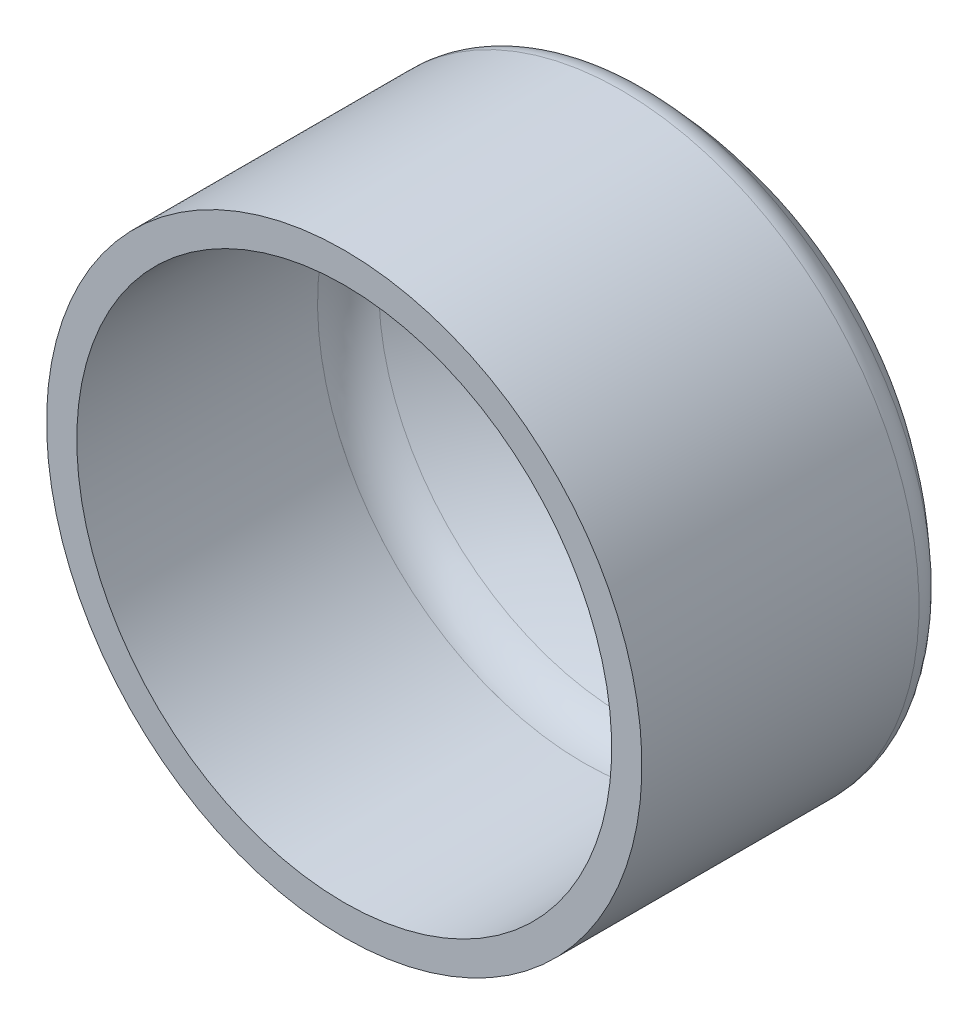
ISO-10303-21;
HEADER;
FILE_DESCRIPTION(('STEP AP214'),'2;1');
FILE_NAME('part.step','',(''),(''),'','','');
FILE_SCHEMA(('AUTOMOTIVE_DESIGN { 1 0 10303 214 1 1 1 1 }'));
ENDSEC;
DATA;
#1=APPLICATION_CONTEXT('core data for automotive mechanical design processes');
#2=APPLICATION_PROTOCOL_DEFINITION('international standard','automotive_design',2000,#1);
#3=PRODUCT_CONTEXT('',#1,'mechanical');
#4=PRODUCT('Part','Part','',(#3));
#5=PRODUCT_RELATED_PRODUCT_CATEGORY('part','',(#4));
#6=PRODUCT_DEFINITION_FORMATION('','',#4);
#7=PRODUCT_DEFINITION_CONTEXT('part definition',#1,'design');
#8=PRODUCT_DEFINITION('design','',#6,#7);
#9=PRODUCT_DEFINITION_SHAPE('','',#8);
#10=(LENGTH_UNIT() NAMED_UNIT(*) SI_UNIT(.MILLI.,.METRE.));
#11=(NAMED_UNIT(*) PLANE_ANGLE_UNIT() SI_UNIT($,.RADIAN.));
#12=(NAMED_UNIT(*) SI_UNIT($,.STERADIAN.) SOLID_ANGLE_UNIT());
#13=UNCERTAINTY_MEASURE_WITH_UNIT(LENGTH_MEASURE(1.E-05),#10,'distance_accuracy_value','');
#14=(GEOMETRIC_REPRESENTATION_CONTEXT(3) GLOBAL_UNCERTAINTY_ASSIGNED_CONTEXT((#13)) GLOBAL_UNIT_ASSIGNED_CONTEXT((#10,
#11,#12)) REPRESENTATION_CONTEXT('',''));
#15=CARTESIAN_POINT('',(0.,0.,0.));
#16=DIRECTION('',(0.,0.,1.));
#17=DIRECTION('',(1.,0.,0.));
#18=AXIS2_PLACEMENT_3D('',#15,#16,#17);
#19=CARTESIAN_POINT('',(0.,0.,45.339));
#20=DIRECTION('',(0.,0.,1.));
#21=DIRECTION('',(0.,-1.,0.));
#22=AXIS2_PLACEMENT_3D('',#19,#20,#21);
#23=SPHERICAL_SURFACE('',#22,80.9498);
#24=CARTESIAN_POINT('',(0.,0.,-15.9266692871763));
#25=DIRECTION('',(0.,0.,1.));
#26=DIRECTION('',(0.,-1.,0.));
#27=AXIS2_PLACEMENT_3D('',#24,#25,#26);
#28=CIRCLE('',#27,52.9092419793966);
#29=CARTESIAN_POINT('',(0.,-52.9092419793966,-15.9266692871763));
#30=VERTEX_POINT('',#29);
#31=EDGE_CURVE('E41',#30,#30,#28,.T.);
#32=ORIENTED_EDGE('',*,*,#31,.T.);
#33=EDGE_LOOP('',(#32));
#34=FACE_BOUND('',#33,.T.);
#35=ADVANCED_FACE('F30',(#34),#23,.F.);
#36=CARTESIAN_POINT('',(0.,0.,-6.91079263336841));
#37=DIRECTION('',(0.,0.,1.));
#38=DIRECTION('',(0.,-1.,0.));
#39=AXIS2_PLACEMENT_3D('',#36,#37,#38);
#40=TOROIDAL_SURFACE('',#39,45.1231,11.9126);
#41=CARTESIAN_POINT('',(0.,0.,-6.91079263336841));
#42=DIRECTION('',(0.,0.,1.));
#43=DIRECTION('',(0.,-1.,0.));
#44=AXIS2_PLACEMENT_3D('',#41,#42,#43);
#45=CIRCLE('',#44,57.0357);
#46=CARTESIAN_POINT('',(0.,-57.0357,-6.91079263336841));
#47=VERTEX_POINT('',#46);
#48=EDGE_CURVE('E45',#47,#47,#45,.T.);
#49=ORIENTED_EDGE('',*,*,#48,.T.);
#50=EDGE_LOOP('',(#49));
#51=FACE_BOUND('',#50,.T.);
#52=ORIENTED_EDGE('',*,*,#31,.F.);
#53=EDGE_LOOP('',(#52));
#54=FACE_BOUND('',#53,.T.);
#55=ADVANCED_FACE('F75',(#51,#54),#40,.F.);
#56=CARTESIAN_POINT('',(0.,0.,44.3992));
#57=DIRECTION('',(0.,0.,1.));
#58=DIRECTION('',(0.,-1.,0.));
#59=AXIS2_PLACEMENT_3D('',#56,#57,#58);
#60=CYLINDRICAL_SURFACE('',#59,57.0357);
#61=CARTESIAN_POINT('',(0.,0.,-6.90880000000001));
#62=DIRECTION('',(0.,0.,1.));
#63=DIRECTION('',(0.,-1.,0.));
#64=AXIS2_PLACEMENT_3D('',#61,#62,#63);
#65=CIRCLE('',#64,57.0357);
#66=CARTESIAN_POINT('',(0.,-57.0357,-6.90880000000001));
#67=VERTEX_POINT('',#66);
#68=EDGE_CURVE('E50',#67,#67,#65,.T.);
#69=ORIENTED_EDGE('',*,*,#68,.T.);
#70=EDGE_LOOP('',(#69));
#71=FACE_BOUND('',#70,.T.);
#72=ORIENTED_EDGE('',*,*,#48,.F.);
#73=EDGE_LOOP('',(#72));
#74=FACE_BOUND('',#73,.T.);
#75=ADVANCED_FACE('F80',(#71,#74),#60,.F.);
#76=CARTESIAN_POINT('',(0.,0.,-6.90880000000001));
#77=DIRECTION('',(0.,0.,1.));
#78=DIRECTION('',(0.,-1.,0.));
#79=AXIS2_PLACEMENT_3D('',#76,#77,#78);
#80=CONICAL_SURFACE('',#79,57.0357,0.0066830688188426);
#81=CARTESIAN_POINT('',(0.,0.,44.3992));
#82=DIRECTION('',(0.,0.,1.));
#83=DIRECTION('',(0.,-1.,0.));
#84=AXIS2_PLACEMENT_3D('',#81,#82,#83);
#85=CIRCLE('',#84,57.3786);
#86=CARTESIAN_POINT('',(0.,-57.3786,44.3992));
#87=VERTEX_POINT('',#86);
#88=EDGE_CURVE('E53',#87,#87,#85,.T.);
#89=ORIENTED_EDGE('',*,*,#88,.T.);
#90=EDGE_LOOP('',(#89));
#91=FACE_BOUND('',#90,.T.);
#92=ORIENTED_EDGE('',*,*,#68,.F.);
#93=EDGE_LOOP('',(#92));
#94=FACE_BOUND('',#93,.T.);
#95=ADVANCED_FACE('F72',(#91,#94),#80,.F.);
#96=CARTESIAN_POINT('',(0.,-57.3786,44.3992));
#97=DIRECTION('',(0.,0.,1.));
#98=DIRECTION('',(0.,-1.,0.));
#99=AXIS2_PLACEMENT_3D('',#96,#97,#98);
#100=PLANE('',#99);
#101=CARTESIAN_POINT('',(0.,0.,44.3992));
#102=DIRECTION('',(0.,0.,1.));
#103=DIRECTION('',(0.,-1.,0.));
#104=AXIS2_PLACEMENT_3D('',#101,#102,#103);
#105=CIRCLE('',#104,63.8556);
#106=CARTESIAN_POINT('',(0.,-63.8556,44.3992));
#107=VERTEX_POINT('',#106);
#108=EDGE_CURVE('E56',#107,#107,#105,.T.);
#109=ORIENTED_EDGE('',*,*,#108,.T.);
#110=EDGE_LOOP('',(#109));
#111=FACE_BOUND('',#110,.T.);
#112=ORIENTED_EDGE('',*,*,#88,.F.);
#113=EDGE_LOOP('',(#112));
#114=FACE_BOUND('',#113,.T.);
#115=ADVANCED_FACE('F60',(#111,#114),#100,.T.);
#116=CARTESIAN_POINT('',(0.,0.,44.3992));
#117=DIRECTION('',(0.,0.,1.));
#118=DIRECTION('',(0.,-1.,0.));
#119=AXIS2_PLACEMENT_3D('',#116,#117,#118);
#120=CYLINDRICAL_SURFACE('',#119,63.8556);
#121=CARTESIAN_POINT('',(0.,0.,-15.0488950442885));
#122=DIRECTION('',(0.,0.,1.));
#123=DIRECTION('',(0.,-1.,0.));
#124=AXIS2_PLACEMENT_3D('',#121,#122,#123);
#125=CIRCLE('',#124,63.8556);
#126=CARTESIAN_POINT('',(0.,-63.8556,-15.0488950442885));
#127=VERTEX_POINT('',#126);
#128=EDGE_CURVE('E37',#127,#127,#125,.T.);
#129=ORIENTED_EDGE('',*,*,#128,.T.);
#130=EDGE_LOOP('',(#129));
#131=FACE_BOUND('',#130,.T.);
#132=ORIENTED_EDGE('',*,*,#108,.F.);
#133=EDGE_LOOP('',(#132));
#134=FACE_BOUND('',#133,.T.);
#135=ADVANCED_FACE('F63',(#131,#134),#120,.T.);
#136=CARTESIAN_POINT('',(0.,0.,45.339));
#137=DIRECTION('',(0.,0.,1.));
#138=DIRECTION('',(0.,-1.,0.));
#139=AXIS2_PLACEMENT_3D('',#136,#137,#138);
#140=SPHERICAL_SURFACE('',#139,89.7382);
#141=CARTESIAN_POINT('',(0.,0.,-19.6474249745572));
#142=DIRECTION('',(0.,0.,1.));
#143=DIRECTION('',(0.,-1.,0.));
#144=AXIS2_PLACEMENT_3D('',#141,#142,#143);
#145=CIRCLE('',#144,61.8846435577216);
#146=CARTESIAN_POINT('',(0.,-61.8846435577216,-19.6474249745572));
#147=VERTEX_POINT('',#146);
#148=EDGE_CURVE('E10',#147,#147,#145,.F.);
#149=ORIENTED_EDGE('',*,*,#148,.T.);
#150=EDGE_LOOP('',(#149));
#151=FACE_BOUND('',#150,.T.);
#152=ADVANCED_FACE('F65',(#151),#140,.T.);
#153=CARTESIAN_POINT('',(0.,0.,-15.0488950442885));
#154=DIRECTION('',(0.,0.,1.));
#155=DIRECTION('',(0.,-1.,0.));
#156=AXIS2_PLACEMENT_3D('',#153,#154,#155);
#157=TOROIDAL_SURFACE('',#156,57.5056,6.35);
#158=ORIENTED_EDGE('',*,*,#148,.F.);
#159=EDGE_LOOP('',(#158));
#160=FACE_BOUND('',#159,.T.);
#161=ORIENTED_EDGE('',*,*,#128,.F.);
#162=EDGE_LOOP('',(#161));
#163=FACE_BOUND('',#162,.T.);
#164=ADVANCED_FACE('F32',(#160,#163),#157,.T.);
#165=CLOSED_SHELL('',(#35,#55,#75,#95,#115,#135,#152,#164));
#166=MANIFOLD_SOLID_BREP('B2',#165);
#167=ADVANCED_BREP_SHAPE_REPRESENTATION('',(#18,#166),#14);
#168=SHAPE_DEFINITION_REPRESENTATION(#9,#167);
ENDSEC;
END-ISO-10303-21;
